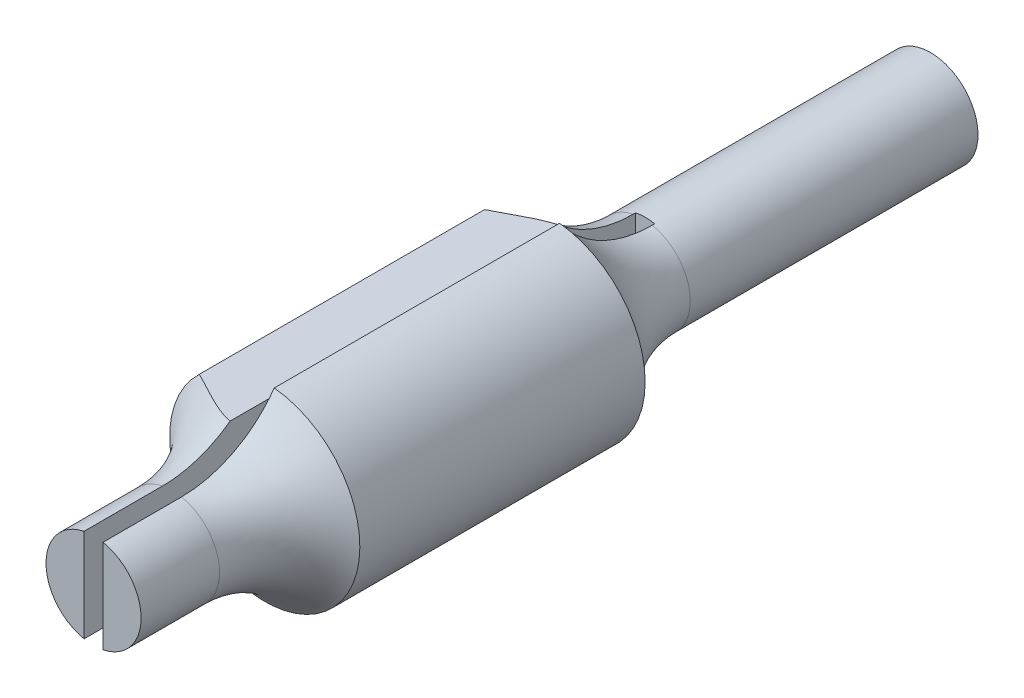
ISO-10303-21;
HEADER;
FILE_DESCRIPTION(('STEP AP214'),'2;1');
FILE_NAME('part.step','',(''),(''),'','','');
FILE_SCHEMA(('AUTOMOTIVE_DESIGN { 1 0 10303 214 1 1 1 1 }'));
ENDSEC;
DATA;
#1=APPLICATION_CONTEXT('core data for automotive mechanical design processes');
#2=APPLICATION_PROTOCOL_DEFINITION('international standard','automotive_design',2000,#1);
#3=PRODUCT_CONTEXT('',#1,'mechanical');
#4=PRODUCT('Part','Part','',(#3));
#5=PRODUCT_RELATED_PRODUCT_CATEGORY('part','',(#4));
#6=PRODUCT_DEFINITION_FORMATION('','',#4);
#7=PRODUCT_DEFINITION_CONTEXT('part definition',#1,'design');
#8=PRODUCT_DEFINITION('design','',#6,#7);
#9=PRODUCT_DEFINITION_SHAPE('','',#8);
#10=(LENGTH_UNIT() NAMED_UNIT(*) SI_UNIT(.MILLI.,.METRE.));
#11=(NAMED_UNIT(*) PLANE_ANGLE_UNIT() SI_UNIT($,.RADIAN.));
#12=(NAMED_UNIT(*) SI_UNIT($,.STERADIAN.) SOLID_ANGLE_UNIT());
#13=UNCERTAINTY_MEASURE_WITH_UNIT(LENGTH_MEASURE(1.E-05),#10,'distance_accuracy_value','');
#14=(GEOMETRIC_REPRESENTATION_CONTEXT(3) GLOBAL_UNCERTAINTY_ASSIGNED_CONTEXT((#13)) GLOBAL_UNIT_ASSIGNED_CONTEXT((#10,
#11,#12)) REPRESENTATION_CONTEXT('',''));
#15=CARTESIAN_POINT('',(0.,0.,0.));
#16=DIRECTION('',(0.,0.,1.));
#17=DIRECTION('',(1.,0.,0.));
#18=AXIS2_PLACEMENT_3D('',#15,#16,#17);
#19=CARTESIAN_POINT('',(0.,0.,15.));
#20=DIRECTION('',(0.,0.,-1.));
#21=DIRECTION('',(-1.,0.,0.));
#22=AXIS2_PLACEMENT_3D('',#19,#20,#21);
#23=CYLINDRICAL_SURFACE('',#22,5.);
#24=DIRECTION('',(0.,0.,1.));
#25=VECTOR('',#24,1.);
#26=CARTESIAN_POINT('',(-3.44054627095419,3.62803546804923,-5.));
#27=LINE('',#26,#25);
#28=CARTESIAN_POINT('',(-3.44054627095419,3.62803546804923,0.));
#29=VERTEX_POINT('',#28);
#30=CARTESIAN_POINT('',(-3.44054627095419,3.62803546804923,15.));
#31=VERTEX_POINT('',#30);
#32=EDGE_CURVE('E147',#29,#31,#27,.T.);
#33=ORIENTED_EDGE('',*,*,#32,.F.);
#34=CARTESIAN_POINT('',(0.,0.,0.));
#35=DIRECTION('',(0.,0.,1.));
#36=DIRECTION('',(1.,0.,0.));
#37=AXIS2_PLACEMENT_3D('',#34,#35,#36);
#38=CIRCLE('',#37,5.);
#39=CARTESIAN_POINT('',(0.5,4.9749371855331,0.));
#40=VERTEX_POINT('',#39);
#41=EDGE_CURVE('E152',#29,#40,#38,.T.);
#42=ORIENTED_EDGE('',*,*,#41,.T.);
#43=DIRECTION('',(0.,0.,1.));
#44=VECTOR('',#43,1.);
#45=CARTESIAN_POINT('',(0.5,4.9749371855331,-5.));
#46=LINE('',#45,#44);
#47=CARTESIAN_POINT('',(0.5,4.9749371855331,15.));
#48=VERTEX_POINT('',#47);
#49=EDGE_CURVE('E135',#40,#48,#46,.T.);
#50=ORIENTED_EDGE('',*,*,#49,.T.);
#51=CARTESIAN_POINT('',(0.,0.,15.));
#52=DIRECTION('',(0.,0.,1.));
#53=DIRECTION('',(1.,0.,0.));
#54=AXIS2_PLACEMENT_3D('',#51,#52,#53);
#55=CIRCLE('',#54,5.);
#56=EDGE_CURVE('E155',#31,#48,#55,.T.);
#57=ORIENTED_EDGE('',*,*,#56,.F.);
#58=EDGE_LOOP('',(#33,#42,#50,#57));
#59=FACE_BOUND('',#58,.T.);
#60=ADVANCED_FACE('F37',(#59),#23,.T.);
#61=CARTESIAN_POINT('',(0.,0.,-20.));
#62=DIRECTION('',(0.,0.,1.));
#63=DIRECTION('',(1.,0.,0.));
#64=AXIS2_PLACEMENT_3D('',#61,#62,#63);
#65=CYLINDRICAL_SURFACE('',#64,2.5);
#66=CARTESIAN_POINT('',(0.,0.,-20.));
#67=DIRECTION('',(0.,0.,-1.));
#68=DIRECTION('',(-1.,0.,0.));
#69=AXIS2_PLACEMENT_3D('',#66,#67,#68);
#70=CIRCLE('',#69,2.5);
#71=CARTESIAN_POINT('',(-2.5,0.,-20.));
#72=VERTEX_POINT('',#71);
#73=EDGE_CURVE('E156',#72,#72,#70,.T.);
#74=ORIENTED_EDGE('',*,*,#73,.F.);
#75=EDGE_LOOP('',(#74));
#76=FACE_BOUND('',#75,.T.);
#77=DIRECTION('',(0.,0.,1.));
#78=VECTOR('',#77,1.);
#79=CARTESIAN_POINT('',(0.5,2.44948974278318,-20.));
#80=LINE('',#79,#78);
#81=CARTESIAN_POINT('',(0.5,2.44948974278318,-4.87339717240448));
#82=VERTEX_POINT('',#81);
#83=CARTESIAN_POINT('',(0.5,2.44948974278318,-5.));
#84=VERTEX_POINT('',#83);
#85=EDGE_CURVE('E289',#82,#84,#80,.F.);
#86=ORIENTED_EDGE('',*,*,#85,.F.);
#87=CARTESIAN_POINT('',(0.,0.,-4.87339717240448));
#88=DIRECTION('',(0.,0.,1.));
#89=DIRECTION('',(1.,0.,0.));
#90=AXIS2_PLACEMENT_3D('',#87,#88,#89);
#91=CIRCLE('',#90,2.5);
#92=CARTESIAN_POINT('',(0.5,-2.44948974278318,-4.87339717240448));
#93=VERTEX_POINT('',#92);
#94=EDGE_CURVE('E161',#82,#93,#91,.F.);
#95=ORIENTED_EDGE('',*,*,#94,.T.);
#96=DIRECTION('',(0.,0.,1.));
#97=VECTOR('',#96,1.);
#98=CARTESIAN_POINT('',(0.5,-2.44948974278318,-20.));
#99=LINE('',#98,#97);
#100=CARTESIAN_POINT('',(0.5,-2.44948974278318,-5.));
#101=VERTEX_POINT('',#100);
#102=EDGE_CURVE('E287',#101,#93,#99,.T.);
#103=ORIENTED_EDGE('',*,*,#102,.F.);
#104=CARTESIAN_POINT('',(0.,0.,-5.));
#105=DIRECTION('',(0.,0.,1.));
#106=DIRECTION('',(1.,0.,0.));
#107=AXIS2_PLACEMENT_3D('',#104,#105,#106);
#108=CIRCLE('',#107,2.5);
#109=CARTESIAN_POINT('',(-0.5,-2.44948974278318,-5.));
#110=VERTEX_POINT('',#109);
#111=EDGE_CURVE('E263',#110,#101,#108,.T.);
#112=ORIENTED_EDGE('',*,*,#111,.F.);
#113=DIRECTION('',(0.,0.,1.));
#114=VECTOR('',#113,1.);
#115=CARTESIAN_POINT('',(-0.5,-2.44948974278318,-20.));
#116=LINE('',#115,#114);
#117=CARTESIAN_POINT('',(-0.5,-2.44948974278318,-4.87339717240448));
#118=VERTEX_POINT('',#117);
#119=EDGE_CURVE('E280',#118,#110,#116,.F.);
#120=ORIENTED_EDGE('',*,*,#119,.F.);
#121=CARTESIAN_POINT('',(0.,0.,-4.87339717240448));
#122=DIRECTION('',(0.,0.,1.));
#123=DIRECTION('',(1.,0.,0.));
#124=AXIS2_PLACEMENT_3D('',#121,#122,#123);
#125=CIRCLE('',#124,2.5);
#126=CARTESIAN_POINT('',(-0.5,2.44948974278318,-4.87339717240448));
#127=VERTEX_POINT('',#126);
#128=EDGE_CURVE('E257',#118,#127,#125,.F.);
#129=ORIENTED_EDGE('',*,*,#128,.T.);
#130=DIRECTION('',(0.,0.,1.));
#131=VECTOR('',#130,1.);
#132=CARTESIAN_POINT('',(-0.5,2.44948974278318,-20.));
#133=LINE('',#132,#131);
#134=CARTESIAN_POINT('',(-0.5,2.44948974278318,-5.));
#135=VERTEX_POINT('',#134);
#136=EDGE_CURVE('E278',#135,#127,#133,.T.);
#137=ORIENTED_EDGE('',*,*,#136,.F.);
#138=EDGE_CURVE('E260',#84,#135,#108,.T.);
#139=ORIENTED_EDGE('',*,*,#138,.F.);
#140=EDGE_LOOP('',(#86,#95,#103,#112,#120,#129,#137,#139));
#141=FACE_BOUND('',#140,.T.);
#142=ADVANCED_FACE('F308',(#76,#141),#65,.T.);
#143=CARTESIAN_POINT('',(0.,0.,24.));
#144=DIRECTION('',(0.,0.,-1.));
#145=DIRECTION('',(-1.,0.,0.));
#146=AXIS2_PLACEMENT_3D('',#143,#144,#145);
#147=CYLINDRICAL_SURFACE('',#146,2.5);
#148=DIRECTION('',(0.,0.,-1.));
#149=VECTOR('',#148,1.);
#150=CARTESIAN_POINT('',(-0.5,2.44948974278318,24.));
#151=LINE('',#150,#149);
#152=CARTESIAN_POINT('',(-0.5,2.44948974278318,19.8733971724045));
#153=VERTEX_POINT('',#152);
#154=CARTESIAN_POINT('',(-0.5,2.44948974278318,24.));
#155=VERTEX_POINT('',#154);
#156=EDGE_CURVE('E285',#153,#155,#151,.F.);
#157=ORIENTED_EDGE('',*,*,#156,.F.);
#158=CARTESIAN_POINT('',(0.,0.,19.8733971724045));
#159=DIRECTION('',(0.,0.,-1.));
#160=DIRECTION('',(-1.,0.,0.));
#161=AXIS2_PLACEMENT_3D('',#158,#159,#160);
#162=CIRCLE('',#161,2.5);
#163=CARTESIAN_POINT('',(-0.5,-2.44948974278318,19.8733971724045));
#164=VERTEX_POINT('',#163);
#165=EDGE_CURVE('E166',#153,#164,#162,.F.);
#166=ORIENTED_EDGE('',*,*,#165,.T.);
#167=DIRECTION('',(0.,0.,-1.));
#168=VECTOR('',#167,1.);
#169=CARTESIAN_POINT('',(-0.5,-2.44948974278318,24.));
#170=LINE('',#169,#168);
#171=CARTESIAN_POINT('',(-0.5,-2.44948974278318,24.));
#172=VERTEX_POINT('',#171);
#173=EDGE_CURVE('E282',#172,#164,#170,.T.);
#174=ORIENTED_EDGE('',*,*,#173,.F.);
#175=CARTESIAN_POINT('',(0.,0.,24.));
#176=DIRECTION('',(0.,0.,1.));
#177=DIRECTION('',(1.,0.,0.));
#178=AXIS2_PLACEMENT_3D('',#175,#176,#177);
#179=CIRCLE('',#178,2.5);
#180=EDGE_CURVE('E274',#155,#172,#179,.T.);
#181=ORIENTED_EDGE('',*,*,#180,.F.);
#182=EDGE_LOOP('',(#157,#166,#174,#181));
#183=FACE_BOUND('',#182,.T.);
#184=ADVANCED_FACE('F320',(#183),#147,.T.);
#185=DIRECTION('',(0.,0.,-1.));
#186=VECTOR('',#185,1.);
#187=CARTESIAN_POINT('',(0.5,-2.44948974278318,24.));
#188=LINE('',#187,#186);
#189=CARTESIAN_POINT('',(0.5,-2.44948974278318,19.8733971724045));
#190=VERTEX_POINT('',#189);
#191=CARTESIAN_POINT('',(0.5,-2.44948974278318,24.));
#192=VERTEX_POINT('',#191);
#193=EDGE_CURVE('E293',#190,#192,#188,.F.);
#194=ORIENTED_EDGE('',*,*,#193,.F.);
#195=CARTESIAN_POINT('',(0.,0.,19.8733971724045));
#196=DIRECTION('',(0.,0.,-1.));
#197=DIRECTION('',(-1.,0.,0.));
#198=AXIS2_PLACEMENT_3D('',#195,#196,#197);
#199=CIRCLE('',#198,2.5);
#200=CARTESIAN_POINT('',(0.5,2.44948974278318,19.8733971724045));
#201=VERTEX_POINT('',#200);
#202=EDGE_CURVE('E162',#190,#201,#199,.F.);
#203=ORIENTED_EDGE('',*,*,#202,.T.);
#204=DIRECTION('',(0.,0.,-1.));
#205=VECTOR('',#204,1.);
#206=CARTESIAN_POINT('',(0.5,2.44948974278318,24.));
#207=LINE('',#206,#205);
#208=CARTESIAN_POINT('',(0.5,2.44948974278318,24.));
#209=VERTEX_POINT('',#208);
#210=EDGE_CURVE('E291',#209,#201,#207,.T.);
#211=ORIENTED_EDGE('',*,*,#210,.F.);
#212=EDGE_CURVE('E275',#192,#209,#179,.T.);
#213=ORIENTED_EDGE('',*,*,#212,.F.);
#214=EDGE_LOOP('',(#194,#203,#211,#213));
#215=FACE_BOUND('',#214,.T.);
#216=ADVANCED_FACE('F334',(#215),#147,.T.);
#217=CARTESIAN_POINT('',(0.,0.,24.));
#218=DIRECTION('',(0.,0.,1.));
#219=DIRECTION('',(1.,0.,0.));
#220=AXIS2_PLACEMENT_3D('',#217,#218,#219);
#221=PLANE('',#220);
#222=ORIENTED_EDGE('',*,*,#180,.T.);
#223=DIRECTION('',(0.,1.,0.));
#224=VECTOR('',#223,1.);
#225=CARTESIAN_POINT('',(-0.5,0.,24.));
#226=LINE('',#225,#224);
#227=EDGE_CURVE('E265',#172,#155,#226,.T.);
#228=ORIENTED_EDGE('',*,*,#227,.T.);
#229=EDGE_LOOP('',(#222,#228));
#230=FACE_BOUND('',#229,.T.);
#231=ADVANCED_FACE('F340',(#230),#221,.T.);
#232=ORIENTED_EDGE('',*,*,#212,.T.);
#233=DIRECTION('',(0.,-1.,0.));
#234=VECTOR('',#233,1.);
#235=CARTESIAN_POINT('',(0.5,0.,24.));
#236=LINE('',#235,#234);
#237=EDGE_CURVE('E268',#209,#192,#236,.T.);
#238=ORIENTED_EDGE('',*,*,#237,.T.);
#239=EDGE_LOOP('',(#232,#238));
#240=FACE_BOUND('',#239,.T.);
#241=ADVANCED_FACE('F337',(#240),#221,.T.);
#242=CARTESIAN_POINT('',(0.,0.,-20.));
#243=DIRECTION('',(0.,0.,-1.));
#244=DIRECTION('',(-1.,0.,0.));
#245=AXIS2_PLACEMENT_3D('',#242,#243,#244);
#246=PLANE('',#245);
#247=ORIENTED_EDGE('',*,*,#73,.T.);
#248=EDGE_LOOP('',(#247));
#249=FACE_BOUND('',#248,.T.);
#250=ADVANCED_FACE('F339',(#249),#246,.T.);
#251=CARTESIAN_POINT('',(0.5,-2.92193464006839,-5.));
#252=DIRECTION('',(0.,1.,0.));
#253=DIRECTION('',(0.,0.,1.));
#254=AXIS2_PLACEMENT_3D('',#251,#252,#253);
#255=PLANE('',#254);
#256=DIRECTION('',(0.,0.,1.));
#257=VECTOR('',#256,1.);
#258=CARTESIAN_POINT('',(0.5,-2.92193464006839,-5.));
#259=LINE('',#258,#257);
#260=CARTESIAN_POINT('',(0.5,-2.92193464006839,-2.55883514008036));
#261=VERTEX_POINT('',#260);
#262=CARTESIAN_POINT('',(0.5,-2.92193464006839,17.5588351400804));
#263=VERTEX_POINT('',#262);
#264=EDGE_CURVE('E57',#261,#263,#259,.T.);
#265=ORIENTED_EDGE('',*,*,#264,.F.);
#266=CARTESIAN_POINT('',(0.5,-2.92193464006839,-2.55883514008036));
#267=CARTESIAN_POINT('',(0.465202504877588,-2.92193464006839,-2.57286596685948));
#268=CARTESIAN_POINT('',(0.429961150953212,-2.92193464006839,-2.58581079195315));
#269=CARTESIAN_POINT('',(0.358559786685946,-2.92193464006839,-2.60910940394003));
#270=CARTESIAN_POINT('',(0.322398089850171,-2.92193464006839,-2.61945799044481));
#271=CARTESIAN_POINT('',(0.213199193947252,-2.92193464006839,-2.64577853690936));
#272=CARTESIAN_POINT('',(0.138967755509738,-2.92193464006839,-2.65723053292062));
#273=CARTESIAN_POINT('',(-0.0110714507573943,-2.92193464006839,-2.66554209621034));
#274=CARTESIAN_POINT('',(-0.0868875554761622,-2.92193464006839,-2.66225510669161));
#275=CARTESIAN_POINT('',(-0.236453645515284,-2.92193464006839,-2.64155562951658));
#276=CARTESIAN_POINT('',(-0.310204315013352,-2.92193464006839,-2.62414787802976));
#277=CARTESIAN_POINT('',(-0.402042349366376,-2.92193464006839,-2.5950523563476));
#278=CARTESIAN_POINT('',(-0.421850612775792,-2.92193464006839,-2.58831791123928));
#279=CARTESIAN_POINT('',(-0.461148051729806,-2.92193464006839,-2.5741123928613));
#280=CARTESIAN_POINT('',(-0.480637878336861,-2.92193464006839,-2.56664312404932));
#281=CARTESIAN_POINT('',(-0.499999999999725,-2.92193464006839,-2.55883514007949));
#282=B_SPLINE_CURVE_WITH_KNOTS('',3,(#266,#267,#268,#269,#270,#271,#272,#273,#274,#275,#276,
#277,#278,#279,#280,#281),.UNSPECIFIED.,.F.,.F.,(4,2,2,2,2,2,2,4),(0.,0.112535990686987,
0.225295628170016,0.449264908823312,0.675466134750004,0.901591523084398,0.964352296899107,
1.02696262771118),.UNSPECIFIED.);
#283=CARTESIAN_POINT('',(-0.5,-2.92193464006839,-2.55883514008036));
#284=VERTEX_POINT('',#283);
#285=EDGE_CURVE('E249',#261,#284,#282,.T.);
#286=ORIENTED_EDGE('',*,*,#285,.T.);
#287=DIRECTION('',(0.,0.,1.));
#288=VECTOR('',#287,1.);
#289=CARTESIAN_POINT('',(-0.5,-2.92193464006839,-5.));
#290=LINE('',#289,#288);
#291=CARTESIAN_POINT('',(-0.5,-2.92193464006839,17.5588351400804));
#292=VERTEX_POINT('',#291);
#293=EDGE_CURVE('E64',#284,#292,#290,.T.);
#294=ORIENTED_EDGE('',*,*,#293,.T.);
#295=CARTESIAN_POINT('',(-0.5,-2.92193464006839,17.5588351400804));
#296=CARTESIAN_POINT('',(-0.465202504877588,-2.92193464006839,17.5728659668595));
#297=CARTESIAN_POINT('',(-0.429961150953212,-2.92193464006839,17.5858107919531));
#298=CARTESIAN_POINT('',(-0.358559786685946,-2.92193464006839,17.60910940394));
#299=CARTESIAN_POINT('',(-0.32239808985017,-2.92193464006839,17.6194579904448));
#300=CARTESIAN_POINT('',(-0.213199193947252,-2.92193464006839,17.6457785369094));
#301=CARTESIAN_POINT('',(-0.138967755509739,-2.92193464006839,17.6572305329206));
#302=CARTESIAN_POINT('',(0.0110714507573931,-2.92193464006839,17.6655420962103));
#303=CARTESIAN_POINT('',(0.0868875554761613,-2.92193464006839,17.6622551066916));
#304=CARTESIAN_POINT('',(0.236453645515282,-2.92193464006839,17.6415556295166));
#305=CARTESIAN_POINT('',(0.310204315013349,-2.92193464006839,17.6241478780297));
#306=CARTESIAN_POINT('',(0.402042349366376,-2.92193464006839,17.5950523563476));
#307=CARTESIAN_POINT('',(0.421850612775794,-2.92193464006839,17.5883179112393));
#308=CARTESIAN_POINT('',(0.461148051729808,-2.92193464006839,17.5741123928613));
#309=CARTESIAN_POINT('',(0.480637878336863,-2.92193464006839,17.5666431240493));
#310=CARTESIAN_POINT('',(0.499999999999725,-2.92193464006839,17.5588351400795));
#311=B_SPLINE_CURVE_WITH_KNOTS('',3,(#295,#296,#297,#298,#299,#300,#301,#302,#303,#304,#305,
#306,#307,#308,#309,#310),.UNSPECIFIED.,.F.,.F.,(4,2,2,2,2,2,2,4),(0.,0.112535990686986,
0.225295628170017,0.449264908823311,0.675466134750003,0.901591523084398,0.964352296899108,
1.02696262771118),.UNSPECIFIED.);
#312=EDGE_CURVE('E51',#292,#263,#311,.T.);
#313=ORIENTED_EDGE('',*,*,#312,.T.);
#314=EDGE_LOOP('',(#265,#286,#294,#313));
#315=FACE_BOUND('',#314,.T.);
#316=ADVANCED_FACE('F230',(#315),#255,.T.);
#317=CARTESIAN_POINT('',(-0.5,3.62803546804923,-5.));
#318=DIRECTION('',(0.,1.,0.));
#319=DIRECTION('',(0.,0.,1.));
#320=AXIS2_PLACEMENT_3D('',#317,#318,#319);
#321=PLANE('',#320);
#322=DIRECTION('',(0.,0.,1.));
#323=VECTOR('',#322,1.);
#324=CARTESIAN_POINT('',(-0.5,3.62803546804923,-5.));
#325=LINE('',#324,#323);
#326=CARTESIAN_POINT('',(-0.5,3.62803546804923,-1.32418275418437));
#327=VERTEX_POINT('',#326);
#328=CARTESIAN_POINT('',(-0.5,3.62803546804923,16.3241827541844));
#329=VERTEX_POINT('',#328);
#330=EDGE_CURVE('E297',#327,#329,#325,.T.);
#331=ORIENTED_EDGE('',*,*,#330,.F.);
#332=CARTESIAN_POINT('',(-0.5,3.62803546804923,-1.32418275418437));
#333=CARTESIAN_POINT('',(-0.628594496913306,3.62803546804923,-1.3002407061211));
#334=CARTESIAN_POINT('',(-0.755155783728676,3.62803546804923,-1.2679877239628));
#335=CARTESIAN_POINT('',(-1.00393725851987,3.62803546804923,-1.19130229348899));
#336=CARTESIAN_POINT('',(-1.12617544044154,3.62803546804923,-1.14692934022793));
#337=CARTESIAN_POINT('',(-1.36683681904619,3.62803546804923,-1.05030726565482));
#338=CARTESIAN_POINT('',(-1.4852721498477,3.62803546804923,-0.998087030008951));
#339=CARTESIAN_POINT('',(-1.7199929780585,3.62803546804923,-0.888673002453177));
#340=CARTESIAN_POINT('',(-1.83627531600189,3.62803546804923,-0.831472510593774));
#341=CARTESIAN_POINT('',(-2.07638389347323,3.62803546804923,-0.70995070931557));
#342=CARTESIAN_POINT('',(-2.20010241699222,3.62803546804923,-0.645420101838763));
#343=CARTESIAN_POINT('',(-2.44695065480718,3.62803546804923,-0.515427585487407));
#344=CARTESIAN_POINT('',(-2.57008067336928,3.62803546804923,-0.449966248396174));
#345=CARTESIAN_POINT('',(-2.81715212722588,3.62803546804923,-0.319331004443354));
#346=CARTESIAN_POINT('',(-2.94109480759013,3.62803546804923,-0.254159424516722));
#347=CARTESIAN_POINT('',(-3.12773482391345,3.62803546804923,-0.157701358902377));
#348=CARTESIAN_POINT('',(-3.19008995322696,3.62803546804923,-0.125754846441775));
#349=CARTESIAN_POINT('',(-3.31508839660837,3.62803546804923,-0.0624243586295218));
#350=CARTESIAN_POINT('',(-3.37773172304813,3.62803546804923,-0.0310404077163397));
#351=CARTESIAN_POINT('',(-3.44054627095419,3.62803546804923,0.));
#352=B_SPLINE_CURVE_WITH_KNOTS('',3,(#332,#333,#334,#335,#336,#337,#338,#339,#340,#341,#342,
#343,#344,#345,#346,#347,#348,#349,#350,#351),.UNSPECIFIED.,.F.,.F.,(4,2,2,2,2,2,2,2,2,4),(0.,
0.391457326386996,0.781026552485938,1.16919540248043,1.55789477334451,1.97649240351003,
2.39484312240849,2.81493336439673,3.02511788415985,3.23531151261524),.UNSPECIFIED.);
#353=EDGE_CURVE('E163',#327,#29,#352,.T.);
#354=ORIENTED_EDGE('',*,*,#353,.T.);
#355=ORIENTED_EDGE('',*,*,#32,.T.);
#356=CARTESIAN_POINT('',(-3.44054627095419,3.62803546804923,15.));
#357=CARTESIAN_POINT('',(-3.31984055640768,3.62803546804923,15.0596043143955));
#358=CARTESIAN_POINT('',(-3.19980861021075,3.62803546804923,15.1205310753526));
#359=CARTESIAN_POINT('',(-2.96067075650975,3.62803546804923,15.2439747378786));
#360=CARTESIAN_POINT('',(-2.84156424931017,3.62803546804923,15.3064904737032));
#361=CARTESIAN_POINT('',(-2.60412343454014,3.62803546804923,15.4319136650056));
#362=CARTESIAN_POINT('',(-2.48578789895746,3.62803546804923,15.4948188267168));
#363=CARTESIAN_POINT('',(-2.24866399721098,3.62803546804923,15.6199548100881));
#364=CARTESIAN_POINT('',(-2.12987539524843,3.62803546804923,15.6821851881681));
#365=CARTESIAN_POINT('',(-1.89019310973728,3.62803546804923,15.8046038466109));
#366=CARTESIAN_POINT('',(-1.76929055511532,3.62803546804923,15.8647750641381));
#367=CARTESIAN_POINT('',(-1.5252853384093,3.62803546804923,15.9800668798308));
#368=CARTESIAN_POINT('',(-1.40218605673351,3.62803546804923,16.0351945524594));
#369=CARTESIAN_POINT('',(-1.15196941084712,3.62803546804923,16.1372942739381));
#370=CARTESIAN_POINT('',(-1.02483924500102,3.62803546804923,16.1842364338637));
#371=CARTESIAN_POINT('',(-0.765900183771176,3.62803546804923,16.2652270098336));
#372=CARTESIAN_POINT('',(-0.634070613381646,3.62803546804923,16.2992079710824));
#373=CARTESIAN_POINT('',(-0.499999999999999,3.62803546804923,16.3241827541844));
#374=B_SPLINE_CURVE_WITH_KNOTS('',3,(#356,#357,#358,#359,#360,#361,#362,#363,#364,#365,#366,
#367,#368,#369,#370,#371,#372,#373),.UNSPECIFIED.,.F.,.F.,(4,2,2,2,2,2,2,2,4),(0.,
0.403826380039079,0.807364590877563,1.20941511760489,1.61171561487237,2.01679331309037,
2.42129381579878,2.82724173264771,3.23527442389646),.UNSPECIFIED.);
#375=EDGE_CURVE('E208',#31,#329,#374,.T.);
#376=ORIENTED_EDGE('',*,*,#375,.T.);
#377=EDGE_LOOP('',(#331,#354,#355,#376));
#378=FACE_BOUND('',#377,.T.);
#379=ADVANCED_FACE('F188',(#378),#321,.T.);
#380=CARTESIAN_POINT('',(0.,0.,-5.));
#381=DIRECTION('',(0.,0.,1.));
#382=DIRECTION('',(1.,0.,0.));
#383=AXIS2_PLACEMENT_3D('',#380,#381,#382);
#384=PLANE('',#383);
#385=ORIENTED_EDGE('',*,*,#138,.T.);
#386=DIRECTION('',(0.,1.,0.));
#387=VECTOR('',#386,1.);
#388=CARTESIAN_POINT('',(-0.5,-2.92193464006839,-5.));
#389=LINE('',#388,#387);
#390=EDGE_CURVE('E148',#110,#135,#389,.T.);
#391=ORIENTED_EDGE('',*,*,#390,.F.);
#392=ORIENTED_EDGE('',*,*,#111,.T.);
#393=DIRECTION('',(0.,-1.,0.));
#394=VECTOR('',#393,1.);
#395=CARTESIAN_POINT('',(0.5,-2.92193464006839,-5.));
#396=LINE('',#395,#394);
#397=EDGE_CURVE('E302',#84,#101,#396,.T.);
#398=ORIENTED_EDGE('',*,*,#397,.F.);
#399=EDGE_LOOP('',(#385,#391,#392,#398));
#400=FACE_BOUND('',#399,.T.);
#401=ADVANCED_FACE('F187',(#400),#384,.T.);
#402=CARTESIAN_POINT('',(-0.5,-2.92193464006839,-5.));
#403=DIRECTION('',(1.,0.,0.));
#404=DIRECTION('',(0.,0.,-1.));
#405=AXIS2_PLACEMENT_3D('',#402,#403,#404);
#406=PLANE('',#405);
#407=ORIENTED_EDGE('',*,*,#136,.T.);
#408=CARTESIAN_POINT('',(-0.5,2.44948974278318,-4.87339717240448));
#409=CARTESIAN_POINT('',(-0.5,2.44946399174222,-4.70547453979983));
#410=CARTESIAN_POINT('',(-0.5,2.45668362919205,-4.53755655690136));
#411=CARTESIAN_POINT('',(-0.5,2.48542514493499,-4.20296728093365));
#412=CARTESIAN_POINT('',(-0.5,2.50694538736193,-4.03629584747489));
#413=CARTESIAN_POINT('',(-0.5,2.56336373876026,-3.70965872938993));
#414=CARTESIAN_POINT('',(-0.5,2.59790306964359,-3.54963088903727));
#415=CARTESIAN_POINT('',(-0.5,2.68005982437417,-3.23297940398289));
#416=CARTESIAN_POINT('',(-0.5,2.72767620808519,-3.07635548960492));
#417=CARTESIAN_POINT('',(-0.5,2.83093019710236,-2.78087889815961));
#418=CARTESIAN_POINT('',(-0.5,2.88552096924642,-2.64165903237765));
#419=CARTESIAN_POINT('',(-0.5,3.00493340413296,-2.36767593482378));
#420=CARTESIAN_POINT('',(-0.5,3.06975512425042,-2.23291272804987));
#421=CARTESIAN_POINT('',(-0.5,3.2109197389767,-1.96538124195428));
#422=CARTESIAN_POINT('',(-0.5,3.28750321698217,-1.83273989171647));
#423=CARTESIAN_POINT('',(-0.5,3.4505100897889,-1.57363758964543));
#424=CARTESIAN_POINT('',(-0.5,3.53693402505748,-1.44717697782254));
#425=CARTESIAN_POINT('',(-0.5,3.62803546804923,-1.32418275418437));
#426=B_SPLINE_CURVE_WITH_KNOTS('',3,(#408,#409,#410,#411,#412,#413,#414,#415,#416,#417,#418,
#419,#420,#421,#422,#423,#424,#425),.UNSPECIFIED.,.F.,.F.,(4,2,2,2,2,2,2,2,4),(0.,
0.503606771349472,1.0071559443317,1.49773772643661,1.9882804994326,2.43649034716816,
2.88470270854587,3.34374754718536,3.80281761011103),.UNSPECIFIED.);
#427=EDGE_CURVE('E168',#127,#327,#426,.T.);
#428=ORIENTED_EDGE('',*,*,#427,.T.);
#429=ORIENTED_EDGE('',*,*,#330,.T.);
#430=CARTESIAN_POINT('',(-0.5,3.62803546804923,16.3241827541844));
#431=CARTESIAN_POINT('',(-0.5,3.52560736365994,16.4624602536079));
#432=CARTESIAN_POINT('',(-0.5,3.42909643317536,16.6051251295236));
#433=CARTESIAN_POINT('',(-0.5,3.24857339118057,16.8981779779493));
#434=CARTESIAN_POINT('',(-0.5,3.16456276147991,17.0485668632404));
#435=CARTESIAN_POINT('',(-0.5,3.01177684825767,17.3519176320895));
#436=CARTESIAN_POINT('',(-0.5,2.94265739179562,17.5047062746417));
#437=CARTESIAN_POINT('',(-0.5,2.81746331725605,17.8155169835237));
#438=CARTESIAN_POINT('',(-0.5,2.76138648920138,17.9735381580483));
#439=CARTESIAN_POINT('',(-0.5,2.66923591592217,18.2726443305393));
#440=CARTESIAN_POINT('',(-0.5,2.63150064873795,18.4132200833557));
#441=CARTESIAN_POINT('',(-0.5,2.56646565803018,18.696758651252));
#442=CARTESIAN_POINT('',(-0.5,2.53916510634214,18.8397212759546));
#443=CARTESIAN_POINT('',(-0.5,2.4946813861035,19.1306600220642));
#444=CARTESIAN_POINT('',(-0.5,2.47775153743772,19.2786749367698));
#445=CARTESIAN_POINT('',(-0.5,2.45514665326718,19.5755911075358));
#446=CARTESIAN_POINT('',(-0.5,2.44947388868992,19.7244925363601));
#447=CARTESIAN_POINT('',(-0.5,2.44948974278318,19.8733971724045));
#448=B_SPLINE_CURVE_WITH_KNOTS('',3,(#430,#431,#432,#433,#434,#435,#436,#437,#438,#439,#440,
#441,#442,#443,#444,#445,#446,#447),.UNSPECIFIED.,.F.,.F.,(4,2,2,2,2,2,2,2,4),(0.,
0.516096915210684,1.03225496087962,1.53476196163991,2.0371837541652,2.47345940332666,
2.90970041972205,3.3562116433245,3.80281293390785),.UNSPECIFIED.);
#449=EDGE_CURVE('E215',#329,#153,#448,.T.);
#450=ORIENTED_EDGE('',*,*,#449,.T.);
#451=ORIENTED_EDGE('',*,*,#156,.T.);
#452=ORIENTED_EDGE('',*,*,#227,.F.);
#453=ORIENTED_EDGE('',*,*,#173,.T.);
#454=CARTESIAN_POINT('',(-0.5,-2.44948974278318,19.8733971724045));
#455=CARTESIAN_POINT('',(-0.5,-2.4494639441548,19.7062963940032));
#456=CARTESIAN_POINT('',(-0.5,-2.45661322990476,19.5391982862667));
#457=CARTESIAN_POINT('',(-0.5,-2.48507995299287,19.2061778190454));
#458=CARTESIAN_POINT('',(-0.5,-2.50640027639131,19.0402557060207));
#459=CARTESIAN_POINT('',(-0.5,-2.56256320106255,18.7135244028541));
#460=CARTESIAN_POINT('',(-0.5,-2.59717861484163,18.5526759800391));
#461=CARTESIAN_POINT('',(-0.5,-2.67961523529792,18.2344438031857));
#462=CARTESIAN_POINT('',(-0.5,-2.72743118454164,18.0770586966853));
#463=CARTESIAN_POINT('',(-0.5,-2.80304418411086,17.8606780526189));
#464=CARTESIAN_POINT('',(-0.5,-2.82545350028583,17.7997572271521));
#465=CARTESIAN_POINT('',(-0.5,-2.87223036802573,17.6787015201347));
#466=CARTESIAN_POINT('',(-0.5,-2.89659709102407,17.6185663184335));
#467=CARTESIAN_POINT('',(-0.5,-2.92193464006839,17.5588351400804));
#468=B_SPLINE_CURVE_WITH_KNOTS('',3,(#454,#455,#456,#457,#458,#459,#460,#461,#462,#463,#464,
#465,#466,#467),.UNSPECIFIED.,.F.,.F.,(4,2,2,2,2,2,4),(0.,0.501147376299169,1.00239684709068,
1.49543682983661,1.98828073003418,2.1829887829705,2.37761484632408),.UNSPECIFIED.);
#469=EDGE_CURVE('E221',#164,#292,#468,.T.);
#470=ORIENTED_EDGE('',*,*,#469,.T.);
#471=ORIENTED_EDGE('',*,*,#293,.F.);
#472=CARTESIAN_POINT('',(-0.5,-2.92193464006839,-2.55883514008036));
#473=CARTESIAN_POINT('',(-0.5,-2.8558792078704,-2.71450425261382));
#474=CARTESIAN_POINT('',(-0.5,-2.79643310020714,-2.87298781433598));
#475=CARTESIAN_POINT('',(-0.5,-2.69115599894715,-3.1945410194595));
#476=CARTESIAN_POINT('',(-0.5,-2.64533491964866,-3.35761390831232));
#477=CARTESIAN_POINT('',(-0.5,-2.56845226986684,-3.68430832900337));
#478=CARTESIAN_POINT('',(-0.5,-2.53715584877366,-3.84787469843739));
#479=CARTESIAN_POINT('',(-0.5,-2.48850947802605,-4.17696988603277));
#480=CARTESIAN_POINT('',(-0.5,-2.47114882914562,-4.34249709947575));
#481=CARTESIAN_POINT('',(-0.5,-2.45705630615741,-4.56907315690483));
#482=CARTESIAN_POINT('',(-0.5,-2.45422451749184,-4.62978783157293));
#483=CARTESIAN_POINT('',(-0.5,-2.45043848765894,-4.75146493521437));
#484=CARTESIAN_POINT('',(-0.5,-2.44949012032255,-4.81242754696611));
#485=CARTESIAN_POINT('',(-0.5,-2.44948974278319,-4.87339717240448));
#486=B_SPLINE_CURVE_WITH_KNOTS('',3,(#472,#473,#474,#475,#476,#477,#478,#479,#480,#481,#482,
#483,#484,#485),.UNSPECIFIED.,.F.,.F.,(4,2,2,2,2,2,4),(0.,0.50717797954639,1.01472411081349,
1.51375024675929,2.01239288664484,2.19471266039143,2.37760014791756),.UNSPECIFIED.);
#487=EDGE_CURVE('E236',#284,#118,#486,.T.);
#488=ORIENTED_EDGE('',*,*,#487,.T.);
#489=ORIENTED_EDGE('',*,*,#119,.T.);
#490=ORIENTED_EDGE('',*,*,#390,.T.);
#491=EDGE_LOOP('',(#407,#428,#429,#450,#451,#452,#453,#470,#471,#488,#489,#490));
#492=FACE_BOUND('',#491,.T.);
#493=ADVANCED_FACE('F186',(#492),#406,.T.);
#494=CARTESIAN_POINT('',(0.5,4.12482017545774,-5.));
#495=DIRECTION('',(-1.,0.,0.));
#496=DIRECTION('',(0.,0.,1.));
#497=AXIS2_PLACEMENT_3D('',#494,#495,#496);
#498=PLANE('',#497);
#499=ORIENTED_EDGE('',*,*,#102,.T.);
#500=CARTESIAN_POINT('',(0.5,-2.44948974278318,-4.87339717240448));
#501=CARTESIAN_POINT('',(0.5,-2.4494639441548,-4.70629639400324));
#502=CARTESIAN_POINT('',(0.5,-2.45661322990476,-4.53919828626674));
#503=CARTESIAN_POINT('',(0.5,-2.48507995299287,-4.20617781904538));
#504=CARTESIAN_POINT('',(0.5,-2.50640027639131,-4.04025570602069));
#505=CARTESIAN_POINT('',(0.5,-2.56256320106255,-3.71352440285406));
#506=CARTESIAN_POINT('',(0.5,-2.59717861484163,-3.55267598003913));
#507=CARTESIAN_POINT('',(0.5,-2.67961523529792,-3.23444380318566));
#508=CARTESIAN_POINT('',(0.5,-2.72743118454164,-3.0770586966853));
#509=CARTESIAN_POINT('',(0.5,-2.80304418411086,-2.86067805261891));
#510=CARTESIAN_POINT('',(0.5,-2.82545350028584,-2.79975722715205));
#511=CARTESIAN_POINT('',(0.5,-2.87223036802572,-2.67870152013469));
#512=CARTESIAN_POINT('',(0.5,-2.89659709102407,-2.61856631843345));
#513=CARTESIAN_POINT('',(0.5,-2.92193464006839,-2.55883514008036));
#514=B_SPLINE_CURVE_WITH_KNOTS('',3,(#500,#501,#502,#503,#504,#505,#506,#507,#508,#509,#510,
#511,#512,#513),.UNSPECIFIED.,.F.,.F.,(4,2,2,2,2,2,4),(0.,0.501147376299173,1.00239684709069,
1.49543682983661,1.98828073003418,2.1829887829705,2.37761484632408),.UNSPECIFIED.);
#515=EDGE_CURVE('E194',#93,#261,#514,.T.);
#516=ORIENTED_EDGE('',*,*,#515,.T.);
#517=ORIENTED_EDGE('',*,*,#264,.T.);
#518=CARTESIAN_POINT('',(0.5,-2.92193464006839,17.5588351400804));
#519=CARTESIAN_POINT('',(0.5,-2.8558792078704,17.7145042526138));
#520=CARTESIAN_POINT('',(0.5,-2.79643310020714,17.872987814336));
#521=CARTESIAN_POINT('',(0.5,-2.69115599894715,18.1945410194595));
#522=CARTESIAN_POINT('',(0.5,-2.64533491964866,18.3576139083123));
#523=CARTESIAN_POINT('',(0.5,-2.56845226986684,18.6843083290034));
#524=CARTESIAN_POINT('',(0.5,-2.53715584877366,18.8478746984374));
#525=CARTESIAN_POINT('',(0.5,-2.48850947802605,19.1769698860328));
#526=CARTESIAN_POINT('',(0.5,-2.47114882914562,19.3424970994758));
#527=CARTESIAN_POINT('',(0.5,-2.45705630615741,19.5690731569048));
#528=CARTESIAN_POINT('',(0.5,-2.45422451749184,19.6297878315729));
#529=CARTESIAN_POINT('',(0.5,-2.45043848765894,19.7514649352144));
#530=CARTESIAN_POINT('',(0.5,-2.44949012032255,19.8124275469661));
#531=CARTESIAN_POINT('',(0.5,-2.44948974278319,19.8733971724045));
#532=B_SPLINE_CURVE_WITH_KNOTS('',3,(#518,#519,#520,#521,#522,#523,#524,#525,#526,#527,#528,
#529,#530,#531),.UNSPECIFIED.,.F.,.F.,(4,2,2,2,2,2,4),(0.,0.507177979546388,1.0147241108135,
1.51375024675929,2.01239288664484,2.19471266039143,2.37760014791756),.UNSPECIFIED.);
#533=EDGE_CURVE('E11',#263,#190,#532,.T.);
#534=ORIENTED_EDGE('',*,*,#533,.T.);
#535=ORIENTED_EDGE('',*,*,#193,.T.);
#536=ORIENTED_EDGE('',*,*,#237,.F.);
#537=ORIENTED_EDGE('',*,*,#210,.T.);
#538=CARTESIAN_POINT('',(0.5,2.44948974278318,19.8733971724045));
#539=CARTESIAN_POINT('',(0.5,2.4494656058139,19.70749220501));
#540=CARTESIAN_POINT('',(0.5,2.45651190185753,19.5415938042344));
#541=CARTESIAN_POINT('',(0.5,2.4845663904802,19.2110051457999));
#542=CARTESIAN_POINT('',(0.5,2.50557253812259,19.0463147147609));
#543=CARTESIAN_POINT('',(0.5,2.56131945158353,18.7195714399581));
#544=CARTESIAN_POINT('',(0.5,2.59603632297905,18.5575145154921));
#545=CARTESIAN_POINT('',(0.5,2.6788792280888,18.2368659439299));
#546=CARTESIAN_POINT('',(0.5,2.72700538922519,18.0782743297784));
#547=CARTESIAN_POINT('',(0.5,2.83644732610667,17.7650916261118));
#548=CARTESIAN_POINT('',(0.5,2.89780841581149,17.6105163778105));
#549=CARTESIAN_POINT('',(0.5,3.03315393874927,17.3069267687478));
#550=CARTESIAN_POINT('',(0.5,3.10714311276571,17.1579145221242));
#551=CARTESIAN_POINT('',(0.5,3.26714205510874,16.8665604123686));
#552=CARTESIAN_POINT('',(0.5,3.35314764023278,16.7242162508438));
#553=CARTESIAN_POINT('',(0.5,3.53661598577832,16.447040914248));
#554=CARTESIAN_POINT('',(0.5,3.63408244324924,16.3122121842939));
#555=CARTESIAN_POINT('',(0.5,3.82546483686571,16.0691835618996));
#556=CARTESIAN_POINT('',(0.5,3.91799252411205,15.9598866520032));
#557=CARTESIAN_POINT('',(0.5,4.11054893719873,15.7481125193343));
#558=CARTESIAN_POINT('',(0.5,4.21057745563671,15.6456351081466));
#559=CARTESIAN_POINT('',(0.5,4.41760157596656,15.4480482655943));
#560=CARTESIAN_POINT('',(0.5,4.5245949341059,15.3529364827711));
#561=CARTESIAN_POINT('',(0.5,4.74505115262316,15.1705034758813));
#562=CARTESIAN_POINT('',(0.5,4.85851480876907,15.0831832134787));
#563=CARTESIAN_POINT('',(0.5,4.9749371855331,15.));
#564=B_SPLINE_CURVE_WITH_KNOTS('',3,(#538,#539,#540,#541,#542,#543,#544,#545,#546,#547,#548,
#549,#550,#551,#552,#553,#554,#555,#556,#557,#558,#559,#560,#561,#562,#563),.UNSPECIFIED.,.F.,
.F.,(4,2,2,2,2,2,2,2,2,2,2,2,4),(0.,0.497555299653194,0.995037729988567,1.49165696967771,
1.98828092866679,2.4866330203483,2.98517261450738,3.48353908544938,3.98206676281579,
4.41132827815335,4.84057792853423,5.26968997220917,5.69885490574953),.UNSPECIFIED.);
#565=EDGE_CURVE('E143',#201,#48,#564,.T.);
#566=ORIENTED_EDGE('',*,*,#565,.T.);
#567=ORIENTED_EDGE('',*,*,#49,.F.);
#568=CARTESIAN_POINT('',(0.5,4.9749371855331,0.));
#569=CARTESIAN_POINT('',(0.5,4.83624845781527,-0.0990836115385577));
#570=CARTESIAN_POINT('',(0.5,4.70176442856039,-0.204045747356121));
#571=CARTESIAN_POINT('',(0.5,4.44211034350445,-0.424912316104462));
#572=CARTESIAN_POINT('',(0.5,4.31694000119928,-0.540816412193763));
#573=CARTESIAN_POINT('',(0.5,4.076832975274,-0.782734413555806));
#574=CARTESIAN_POINT('',(0.5,3.96189427176283,-0.908746314004516));
#575=CARTESIAN_POINT('',(0.5,3.74304181734278,-1.17000064390922));
#576=CARTESIAN_POINT('',(0.5,3.63912781752552,-1.30524286485587));
#577=CARTESIAN_POINT('',(0.5,3.44303185016593,-1.58407422806453));
#578=CARTESIAN_POINT('',(0.5,3.35085520628238,-1.72766711519157));
#579=CARTESIAN_POINT('',(0.5,3.17894344320068,-2.02219095301516));
#580=CARTESIAN_POINT('',(0.5,3.09921323240946,-2.17312476807832));
#581=CARTESIAN_POINT('',(0.5,2.95294987396153,-2.48104095629062));
#582=CARTESIAN_POINT('',(0.5,2.88640051130189,-2.63801561037411));
#583=CARTESIAN_POINT('',(0.5,2.7669153006916,-2.95707047932943));
#584=CARTESIAN_POINT('',(0.5,2.71398305593577,-3.11915203281742));
#585=CARTESIAN_POINT('',(0.5,2.59587319346661,-3.54160612973526));
#586=CARTESIAN_POINT('',(0.5,2.54110000743274,-3.80500770982693));
#587=CARTESIAN_POINT('',(0.5,2.48620397568565,-4.20366681012136));
#588=CARTESIAN_POINT('',(0.5,2.47244921150561,-4.33720793426997));
#589=CARTESIAN_POINT('',(0.5,2.45409134712147,-4.60494701120462));
#590=CARTESIAN_POINT('',(0.5,2.44949024956068,-4.7391451012856));
#591=CARTESIAN_POINT('',(0.5,2.44948974278318,-4.87339717240448));
#592=B_SPLINE_CURVE_WITH_KNOTS('',3,(#568,#569,#570,#571,#572,#573,#574,#575,#576,#577,#578,
#579,#580,#581,#582,#583,#584,#585,#586,#587,#588,#589,#590,#591),.UNSPECIFIED.,.F.,.F.,(4,2,2,
2,2,2,2,2,2,2,2,4),(0.,0.511183507878467,1.02235128441717,1.5334179233277,2.0444730212608,
2.55575909665708,3.06724629751296,3.57810030724342,4.08908935418251,4.8933162965639,
5.29579855836916,5.69836886574561),.UNSPECIFIED.);
#593=EDGE_CURVE('E140',#40,#82,#592,.T.);
#594=ORIENTED_EDGE('',*,*,#593,.T.);
#595=ORIENTED_EDGE('',*,*,#85,.T.);
#596=ORIENTED_EDGE('',*,*,#397,.T.);
#597=EDGE_LOOP('',(#499,#516,#517,#534,#535,#536,#537,#566,#567,#594,#595,#596));
#598=FACE_BOUND('',#597,.T.);
#599=ADVANCED_FACE('F138',(#598),#498,.T.);
#600=CARTESIAN_POINT('',(0.,0.,-4.87339717240448));
#601=DIRECTION('',(0.,0.,1.));
#602=DIRECTION('',(1.,0.,0.));
#603=AXIS2_PLACEMENT_3D('',#600,#601,#602);
#604=TOROIDAL_SURFACE('',#603,8.5,6.);
#605=ORIENTED_EDGE('',*,*,#593,.F.);
#606=ORIENTED_EDGE('',*,*,#41,.F.);
#607=ORIENTED_EDGE('',*,*,#353,.F.);
#608=ORIENTED_EDGE('',*,*,#427,.F.);
#609=ORIENTED_EDGE('',*,*,#128,.F.);
#610=ORIENTED_EDGE('',*,*,#487,.F.);
#611=ORIENTED_EDGE('',*,*,#285,.F.);
#612=ORIENTED_EDGE('',*,*,#515,.F.);
#613=ORIENTED_EDGE('',*,*,#94,.F.);
#614=EDGE_LOOP('',(#605,#606,#607,#608,#609,#610,#611,#612,#613));
#615=FACE_BOUND('',#614,.T.);
#616=ADVANCED_FACE('F159',(#615),#604,.F.);
#617=CARTESIAN_POINT('',(0.,0.,19.8733971724045));
#618=DIRECTION('',(0.,0.,-1.));
#619=DIRECTION('',(-1.,0.,0.));
#620=AXIS2_PLACEMENT_3D('',#617,#618,#619);
#621=TOROIDAL_SURFACE('',#620,8.5,6.);
#622=ORIENTED_EDGE('',*,*,#375,.F.);
#623=ORIENTED_EDGE('',*,*,#56,.T.);
#624=ORIENTED_EDGE('',*,*,#565,.F.);
#625=ORIENTED_EDGE('',*,*,#202,.F.);
#626=ORIENTED_EDGE('',*,*,#533,.F.);
#627=ORIENTED_EDGE('',*,*,#312,.F.);
#628=ORIENTED_EDGE('',*,*,#469,.F.);
#629=ORIENTED_EDGE('',*,*,#165,.F.);
#630=ORIENTED_EDGE('',*,*,#449,.F.);
#631=EDGE_LOOP('',(#622,#623,#624,#625,#626,#627,#628,#629,#630));
#632=FACE_BOUND('',#631,.T.);
#633=ADVANCED_FACE('F39',(#632),#621,.F.);
#634=CLOSED_SHELL('',(#60,#142,#184,#216,#231,#241,#250,#316,#379,#401,#493,#599,#616,#633));
#635=MANIFOLD_SOLID_BREP('B2',#634);
#636=ADVANCED_BREP_SHAPE_REPRESENTATION('',(#18,#635),#14);
#637=SHAPE_DEFINITION_REPRESENTATION(#9,#636);
ENDSEC;
END-ISO-10303-21;
